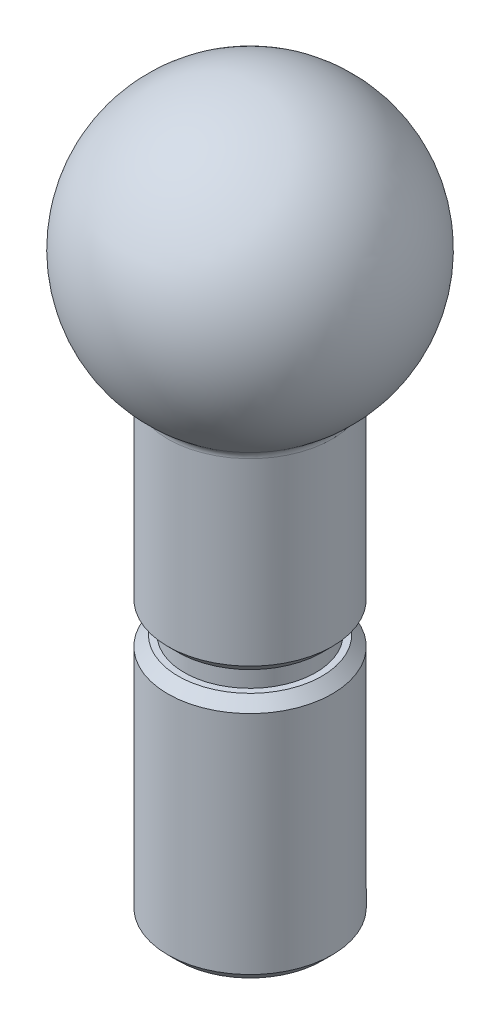
ISO-10303-21;
HEADER;
FILE_DESCRIPTION(('STEP AP214'),'2;1');
FILE_NAME('part.step','',(''),(''),'','','');
FILE_SCHEMA(('AUTOMOTIVE_DESIGN { 1 0 10303 214 1 1 1 1 }'));
ENDSEC;
DATA;
#1=APPLICATION_CONTEXT('core data for automotive mechanical design processes');
#2=APPLICATION_PROTOCOL_DEFINITION('international standard','automotive_design',2000,#1);
#3=PRODUCT_CONTEXT('',#1,'mechanical');
#4=PRODUCT('Part','Part','',(#3));
#5=PRODUCT_RELATED_PRODUCT_CATEGORY('part','',(#4));
#6=PRODUCT_DEFINITION_FORMATION('','',#4);
#7=PRODUCT_DEFINITION_CONTEXT('part definition',#1,'design');
#8=PRODUCT_DEFINITION('design','',#6,#7);
#9=PRODUCT_DEFINITION_SHAPE('','',#8);
#10=(LENGTH_UNIT() NAMED_UNIT(*) SI_UNIT(.MILLI.,.METRE.));
#11=(NAMED_UNIT(*) PLANE_ANGLE_UNIT() SI_UNIT($,.RADIAN.));
#12=(NAMED_UNIT(*) SI_UNIT($,.STERADIAN.) SOLID_ANGLE_UNIT());
#13=UNCERTAINTY_MEASURE_WITH_UNIT(LENGTH_MEASURE(1.E-05),#10,'distance_accuracy_value','');
#14=(GEOMETRIC_REPRESENTATION_CONTEXT(3) GLOBAL_UNCERTAINTY_ASSIGNED_CONTEXT((#13)) GLOBAL_UNIT_ASSIGNED_CONTEXT((#10,
#11,#12)) REPRESENTATION_CONTEXT('',''));
#15=CARTESIAN_POINT('',(0.,0.,0.));
#16=DIRECTION('',(0.,0.,1.));
#17=DIRECTION('',(1.,0.,0.));
#18=AXIS2_PLACEMENT_3D('',#15,#16,#17);
#19=CARTESIAN_POINT('',(0.,0.,0.));
#20=DIRECTION('',(0.,1.,0.));
#21=DIRECTION('',(0.,0.,1.));
#22=AXIS2_PLACEMENT_3D('',#19,#20,#21);
#23=CYLINDRICAL_SURFACE('',#22,40.);
#24=CARTESIAN_POINT('',(0.,-147.44562646538,0.));
#25=DIRECTION('',(0.,-1.,0.));
#26=DIRECTION('',(0.,0.,-1.));
#27=AXIS2_PLACEMENT_3D('',#24,#25,#26);
#28=CIRCLE('',#27,40.);
#29=CARTESIAN_POINT('',(0.,-147.44562646538,-40.));
#30=VERTEX_POINT('',#29);
#31=EDGE_CURVE('E11',#30,#30,#28,.F.);
#32=ORIENTED_EDGE('',*,*,#31,.T.);
#33=EDGE_LOOP('',(#32));
#34=FACE_BOUND('',#33,.T.);
#35=CARTESIAN_POINT('',(0.,-60.,0.));
#36=DIRECTION('',(0.,1.,0.));
#37=DIRECTION('',(0.,0.,1.));
#38=AXIS2_PLACEMENT_3D('',#35,#36,#37);
#39=CIRCLE('',#38,40.);
#40=CARTESIAN_POINT('',(0.,-60.,40.));
#41=VERTEX_POINT('',#40);
#42=EDGE_CURVE('E65',#41,#41,#39,.F.);
#43=ORIENTED_EDGE('',*,*,#42,.T.);
#44=EDGE_LOOP('',(#43));
#45=FACE_BOUND('',#44,.T.);
#46=ADVANCED_FACE('F39',(#34,#45),#23,.T.);
#47=CARTESIAN_POINT('',(0.,0.,0.));
#48=DIRECTION('',(0.,1.,0.));
#49=DIRECTION('',(1.,0.,0.));
#50=AXIS2_PLACEMENT_3D('',#47,#48,#49);
#51=SPHERICAL_SURFACE('',#50,70.);
#52=CARTESIAN_POINT('',(0.,-56.,0.));
#53=DIRECTION('',(0.,1.,0.));
#54=DIRECTION('',(0.,0.,1.));
#55=AXIS2_PLACEMENT_3D('',#52,#53,#54);
#56=CIRCLE('',#55,42.);
#57=CARTESIAN_POINT('',(0.,-56.,42.));
#58=VERTEX_POINT('',#57);
#59=EDGE_CURVE('E68',#58,#58,#56,.T.);
#60=ORIENTED_EDGE('',*,*,#59,.T.);
#61=EDGE_LOOP('',(#60));
#62=FACE_BOUND('',#61,.T.);
#63=ADVANCED_FACE('F84',(#62),#51,.T.);
#64=CARTESIAN_POINT('',(0.,-152.44562646538,0.));
#65=DIRECTION('',(0.,-1.,0.));
#66=DIRECTION('',(0.,0.,-1.));
#67=AXIS2_PLACEMENT_3D('',#64,#65,#66);
#68=PLANE('',#67);
#69=CARTESIAN_POINT('',(0.,-152.44562646538,0.));
#70=DIRECTION('',(0.,-1.,0.));
#71=DIRECTION('',(0.,0.,-1.));
#72=AXIS2_PLACEMENT_3D('',#69,#70,#71);
#73=CIRCLE('',#72,35.);
#74=CARTESIAN_POINT('',(0.,-152.44562646538,-35.));
#75=VERTEX_POINT('',#74);
#76=EDGE_CURVE('E46',#75,#75,#73,.T.);
#77=ORIENTED_EDGE('',*,*,#76,.T.);
#78=EDGE_LOOP('',(#77));
#79=FACE_BOUND('',#78,.T.);
#80=CARTESIAN_POINT('',(0.,-152.44562646538,0.));
#81=DIRECTION('',(0.,-1.,0.));
#82=DIRECTION('',(0.,0.,-1.));
#83=AXIS2_PLACEMENT_3D('',#80,#81,#82);
#84=CIRCLE('',#83,32.);
#85=CARTESIAN_POINT('',(0.,-152.44562646538,-32.));
#86=VERTEX_POINT('',#85);
#87=EDGE_CURVE('E71',#86,#86,#84,.T.);
#88=ORIENTED_EDGE('',*,*,#87,.F.);
#89=EDGE_LOOP('',(#88));
#90=FACE_BOUND('',#89,.T.);
#91=ADVANCED_FACE('F81',(#79,#90),#68,.T.);
#92=CARTESIAN_POINT('',(0.,-162.44562646538,0.));
#93=DIRECTION('',(0.,-1.,0.));
#94=DIRECTION('',(0.,0.,-1.));
#95=AXIS2_PLACEMENT_3D('',#92,#93,#94);
#96=PLANE('',#95);
#97=CARTESIAN_POINT('',(0.,-162.44562646538,0.));
#98=DIRECTION('',(0.,-1.,0.));
#99=DIRECTION('',(0.,0.,-1.));
#100=AXIS2_PLACEMENT_3D('',#97,#98,#99);
#101=CIRCLE('',#100,35.);
#102=CARTESIAN_POINT('',(0.,-162.44562646538,-35.));
#103=VERTEX_POINT('',#102);
#104=EDGE_CURVE('E50',#103,#103,#101,.F.);
#105=ORIENTED_EDGE('',*,*,#104,.T.);
#106=EDGE_LOOP('',(#105));
#107=FACE_BOUND('',#106,.T.);
#108=CARTESIAN_POINT('',(0.,-162.44562646538,0.));
#109=DIRECTION('',(0.,-1.,0.));
#110=DIRECTION('',(0.,0.,-1.));
#111=AXIS2_PLACEMENT_3D('',#108,#109,#110);
#112=CIRCLE('',#111,32.);
#113=CARTESIAN_POINT('',(0.,-162.44562646538,-32.));
#114=VERTEX_POINT('',#113);
#115=EDGE_CURVE('E72',#114,#114,#112,.T.);
#116=ORIENTED_EDGE('',*,*,#115,.T.);
#117=EDGE_LOOP('',(#116));
#118=FACE_BOUND('',#117,.T.);
#119=ADVANCED_FACE('F83',(#107,#118),#96,.F.);
#120=CARTESIAN_POINT('',(0.,-152.44562646538,0.));
#121=DIRECTION('',(0.,-1.,0.));
#122=DIRECTION('',(0.,0.,-1.));
#123=AXIS2_PLACEMENT_3D('',#120,#121,#122);
#124=CYLINDRICAL_SURFACE('',#123,32.);
#125=ORIENTED_EDGE('',*,*,#87,.T.);
#126=EDGE_LOOP('',(#125));
#127=FACE_BOUND('',#126,.T.);
#128=ORIENTED_EDGE('',*,*,#115,.F.);
#129=EDGE_LOOP('',(#128));
#130=FACE_BOUND('',#129,.T.);
#131=ADVANCED_FACE('F78',(#127,#130),#124,.T.);
#132=CARTESIAN_POINT('',(40.,-282.44562646538,0.));
#133=DIRECTION('',(0.,1.,0.));
#134=DIRECTION('',(0.,0.,1.));
#135=AXIS2_PLACEMENT_3D('',#132,#133,#134);
#136=PLANE('',#135);
#137=CARTESIAN_POINT('',(0.,-282.44562646538,0.));
#138=DIRECTION('',(0.,1.,0.));
#139=DIRECTION('',(0.,0.,1.));
#140=AXIS2_PLACEMENT_3D('',#137,#138,#139);
#141=CIRCLE('',#140,35.0000000000001);
#142=CARTESIAN_POINT('',(0.,-282.44562646538,35.0000000000001));
#143=VERTEX_POINT('',#142);
#144=EDGE_CURVE('E54',#143,#143,#141,.F.);
#145=ORIENTED_EDGE('',*,*,#144,.T.);
#146=EDGE_LOOP('',(#145));
#147=FACE_BOUND('',#146,.T.);
#148=ADVANCED_FACE('F104',(#147),#136,.F.);
#149=CARTESIAN_POINT('',(0.,-277.44562646538,0.));
#150=DIRECTION('',(0.,1.,0.));
#151=DIRECTION('',(0.,0.,1.));
#152=AXIS2_PLACEMENT_3D('',#149,#150,#151);
#153=CIRCLE('',#152,40.);
#154=CARTESIAN_POINT('',(0.,-277.44562646538,40.));
#155=VERTEX_POINT('',#154);
#156=EDGE_CURVE('E59',#155,#155,#153,.T.);
#157=ORIENTED_EDGE('',*,*,#156,.T.);
#158=EDGE_LOOP('',(#157));
#159=FACE_BOUND('',#158,.T.);
#160=CARTESIAN_POINT('',(0.,-167.44562646538,0.));
#161=DIRECTION('',(0.,-1.,0.));
#162=DIRECTION('',(0.,0.,-1.));
#163=AXIS2_PLACEMENT_3D('',#160,#161,#162);
#164=CIRCLE('',#163,40.);
#165=CARTESIAN_POINT('',(0.,-167.44562646538,-40.));
#166=VERTEX_POINT('',#165);
#167=EDGE_CURVE('E62',#166,#166,#164,.T.);
#168=ORIENTED_EDGE('',*,*,#167,.T.);
#169=EDGE_LOOP('',(#168));
#170=FACE_BOUND('',#169,.T.);
#171=ADVANCED_FACE('F97',(#159,#170),#23,.T.);
#172=CARTESIAN_POINT('',(0.,-60.,0.));
#173=DIRECTION('',(0.,1.,0.));
#174=DIRECTION('',(0.,0.,1.));
#175=AXIS2_PLACEMENT_3D('',#172,#173,#174);
#176=TOROIDAL_SURFACE('',#175,45.,5.);
#177=ORIENTED_EDGE('',*,*,#42,.F.);
#178=EDGE_LOOP('',(#177));
#179=FACE_BOUND('',#178,.T.);
#180=ORIENTED_EDGE('',*,*,#59,.F.);
#181=EDGE_LOOP('',(#180));
#182=FACE_BOUND('',#181,.T.);
#183=ADVANCED_FACE('F103',(#179,#182),#176,.F.);
#184=CARTESIAN_POINT('',(0.,-277.44562646538,0.));
#185=DIRECTION('',(0.,1.,0.));
#186=DIRECTION('',(0.,0.,1.));
#187=AXIS2_PLACEMENT_3D('',#184,#185,#186);
#188=CONICAL_SURFACE('',#187,40.,0.785398163397447);
#189=ORIENTED_EDGE('',*,*,#144,.F.);
#190=EDGE_LOOP('',(#189));
#191=FACE_BOUND('',#190,.T.);
#192=ORIENTED_EDGE('',*,*,#156,.F.);
#193=EDGE_LOOP('',(#192));
#194=FACE_BOUND('',#193,.T.);
#195=ADVANCED_FACE('F110',(#191,#194),#188,.T.);
#196=CARTESIAN_POINT('',(0.,-167.44562646538,0.));
#197=DIRECTION('',(0.,-1.,0.));
#198=DIRECTION('',(0.,0.,-1.));
#199=AXIS2_PLACEMENT_3D('',#196,#197,#198);
#200=CONICAL_SURFACE('',#199,40.,0.78539816339745);
#201=ORIENTED_EDGE('',*,*,#104,.F.);
#202=EDGE_LOOP('',(#201));
#203=FACE_BOUND('',#202,.T.);
#204=ORIENTED_EDGE('',*,*,#167,.F.);
#205=EDGE_LOOP('',(#204));
#206=FACE_BOUND('',#205,.T.);
#207=ADVANCED_FACE('F118',(#203,#206),#200,.T.);
#208=CARTESIAN_POINT('',(0.,-152.44562646538,0.));
#209=DIRECTION('',(0.,1.,0.));
#210=DIRECTION('',(0.,0.,1.));
#211=AXIS2_PLACEMENT_3D('',#208,#209,#210);
#212=CONICAL_SURFACE('',#211,35.,0.785398163397444);
#213=ORIENTED_EDGE('',*,*,#31,.F.);
#214=EDGE_LOOP('',(#213));
#215=FACE_BOUND('',#214,.T.);
#216=ORIENTED_EDGE('',*,*,#76,.F.);
#217=EDGE_LOOP('',(#216));
#218=FACE_BOUND('',#217,.T.);
#219=ADVANCED_FACE('F41',(#215,#218),#212,.T.);
#220=CLOSED_SHELL('',(#46,#63,#91,#119,#131,#148,#171,#183,#195,#207,#219));
#221=MANIFOLD_SOLID_BREP('B2',#220);
#222=ADVANCED_BREP_SHAPE_REPRESENTATION('',(#18,#221),#14);
#223=SHAPE_DEFINITION_REPRESENTATION(#9,#222);
ENDSEC;
END-ISO-10303-21;
